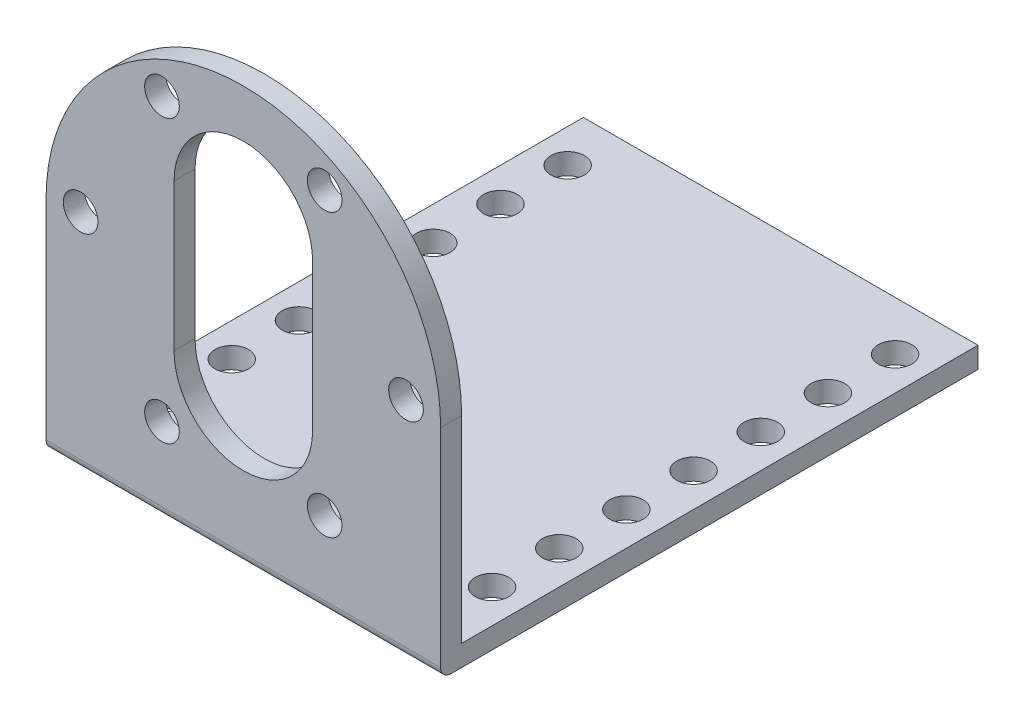
ISO-10303-21;
HEADER;
FILE_DESCRIPTION(('STEP AP214'),'2;1');
FILE_NAME('part.step','',(''),(''),'','','');
FILE_SCHEMA(('AUTOMOTIVE_DESIGN { 1 0 10303 214 1 1 1 1 }'));
ENDSEC;
DATA;
#1=APPLICATION_CONTEXT('core data for automotive mechanical design processes');
#2=APPLICATION_PROTOCOL_DEFINITION('international standard','automotive_design',2000,#1);
#3=PRODUCT_CONTEXT('',#1,'mechanical');
#4=PRODUCT('Part','Part','',(#3));
#5=PRODUCT_RELATED_PRODUCT_CATEGORY('part','',(#4));
#6=PRODUCT_DEFINITION_FORMATION('','',#4);
#7=PRODUCT_DEFINITION_CONTEXT('part definition',#1,'design');
#8=PRODUCT_DEFINITION('design','',#6,#7);
#9=PRODUCT_DEFINITION_SHAPE('','',#8);
#10=(LENGTH_UNIT() NAMED_UNIT(*) SI_UNIT(.MILLI.,.METRE.));
#11=(NAMED_UNIT(*) PLANE_ANGLE_UNIT() SI_UNIT($,.RADIAN.));
#12=(NAMED_UNIT(*) SI_UNIT($,.STERADIAN.) SOLID_ANGLE_UNIT());
#13=UNCERTAINTY_MEASURE_WITH_UNIT(LENGTH_MEASURE(1.E-05),#10,'distance_accuracy_value','');
#14=(GEOMETRIC_REPRESENTATION_CONTEXT(3) GLOBAL_UNCERTAINTY_ASSIGNED_CONTEXT((#13)) GLOBAL_UNIT_ASSIGNED_CONTEXT((#10,
#11,#12)) REPRESENTATION_CONTEXT('',''));
#15=CARTESIAN_POINT('',(0.,0.,0.));
#16=DIRECTION('',(0.,0.,1.));
#17=DIRECTION('',(1.,0.,0.));
#18=AXIS2_PLACEMENT_3D('',#15,#16,#17);
#19=CARTESIAN_POINT('',(37.6,-8.75642674796964,59.0660786090315));
#20=DIRECTION('',(0.,0.,1.));
#21=DIRECTION('',(1.,0.,0.));
#22=AXIS2_PLACEMENT_3D('',#19,#20,#21);
#23=PLANE('',#22);
#24=CARTESIAN_POINT('',(26.5499999999998,-2.73344871752294,59.0660786090315));
#25=DIRECTION('',(0.,0.,-1.));
#26=DIRECTION('',(-1.,0.,0.));
#27=AXIS2_PLACEMENT_3D('',#24,#25,#26);
#28=CIRCLE('',#27,1.65);
#29=CARTESIAN_POINT('',(24.8999999999998,-2.73344871752294,59.0660786090315));
#30=VERTEX_POINT('',#29);
#31=EDGE_CURVE('E358',#30,#30,#28,.T.);
#32=ORIENTED_EDGE('',*,*,#31,.F.);
#33=EDGE_LOOP('',(#32));
#34=FACE_BOUND('',#33,.T.);
#35=CARTESIAN_POINT('',(34.3,10.6899450411358,59.0660786090315));
#36=DIRECTION('',(0.,0.,-1.));
#37=DIRECTION('',(-1.,0.,0.));
#38=AXIS2_PLACEMENT_3D('',#35,#36,#37);
#39=CIRCLE('',#38,1.65);
#40=CARTESIAN_POINT('',(32.65,10.6899450411358,59.0660786090315));
#41=VERTEX_POINT('',#40);
#42=EDGE_CURVE('E352',#41,#41,#39,.T.);
#43=ORIENTED_EDGE('',*,*,#42,.F.);
#44=EDGE_LOOP('',(#43));
#45=FACE_BOUND('',#44,.T.);
#46=CARTESIAN_POINT('',(11.0499999999998,-2.73344871752267,59.0660786090315));
#47=DIRECTION('',(0.,0.,-1.));
#48=DIRECTION('',(-1.,0.,0.));
#49=AXIS2_PLACEMENT_3D('',#46,#47,#48);
#50=CIRCLE('',#49,1.65);
#51=CARTESIAN_POINT('',(9.39999999999975,-2.73344871752267,59.0660786090315));
#52=VERTEX_POINT('',#51);
#53=EDGE_CURVE('E346',#52,#52,#50,.T.);
#54=ORIENTED_EDGE('',*,*,#53,.F.);
#55=EDGE_LOOP('',(#54));
#56=FACE_BOUND('',#55,.T.);
#57=CARTESIAN_POINT('',(3.3,10.6899450411363,59.0660786090315));
#58=DIRECTION('',(0.,0.,-1.));
#59=DIRECTION('',(-1.,0.,0.));
#60=AXIS2_PLACEMENT_3D('',#57,#58,#59);
#61=CIRCLE('',#60,1.65);
#62=CARTESIAN_POINT('',(1.65,10.6899450411363,59.0660786090315));
#63=VERTEX_POINT('',#62);
#64=EDGE_CURVE('E340',#63,#63,#61,.T.);
#65=ORIENTED_EDGE('',*,*,#64,.F.);
#66=EDGE_LOOP('',(#65));
#67=FACE_BOUND('',#66,.T.);
#68=CARTESIAN_POINT('',(11.0500000000001,24.1133387997949,59.0660786090315));
#69=DIRECTION('',(0.,0.,-1.));
#70=DIRECTION('',(-1.,0.,0.));
#71=AXIS2_PLACEMENT_3D('',#68,#69,#70);
#72=CIRCLE('',#71,1.65);
#73=CARTESIAN_POINT('',(9.40000000000013,24.1133387997949,59.0660786090315));
#74=VERTEX_POINT('',#73);
#75=EDGE_CURVE('E334',#74,#74,#72,.T.);
#76=ORIENTED_EDGE('',*,*,#75,.F.);
#77=EDGE_LOOP('',(#76));
#78=FACE_BOUND('',#77,.T.);
#79=CARTESIAN_POINT('',(26.5500000000001,24.1133387997947,59.0660786090315));
#80=DIRECTION('',(0.,0.,-1.));
#81=DIRECTION('',(-1.,0.,0.));
#82=AXIS2_PLACEMENT_3D('',#79,#80,#81);
#83=CIRCLE('',#82,1.65);
#84=CARTESIAN_POINT('',(24.9000000000001,24.1133387997947,59.0660786090315));
#85=VERTEX_POINT('',#84);
#86=EDGE_CURVE('E331',#85,#85,#83,.T.);
#87=ORIENTED_EDGE('',*,*,#86,.F.);
#88=EDGE_LOOP('',(#87));
#89=FACE_BOUND('',#88,.T.);
#90=CARTESIAN_POINT('',(18.8,3.6899450411363,59.0660786090315));
#91=DIRECTION('',(0.,0.,-1.));
#92=DIRECTION('',(-1.,0.,0.));
#93=AXIS2_PLACEMENT_3D('',#90,#91,#92);
#94=CIRCLE('',#93,6.6);
#95=CARTESIAN_POINT('',(25.4,3.6899450411363,59.0660786090315));
#96=VERTEX_POINT('',#95);
#97=CARTESIAN_POINT('',(12.2,3.6899450411363,59.0660786090315));
#98=VERTEX_POINT('',#97);
#99=EDGE_CURVE('E236',#96,#98,#94,.T.);
#100=ORIENTED_EDGE('',*,*,#99,.F.);
#101=DIRECTION('',(0.,-1.,0.));
#102=VECTOR('',#101,1.);
#103=CARTESIAN_POINT('',(25.4,0.,59.0660786090315));
#104=LINE('',#103,#102);
#105=CARTESIAN_POINT('',(25.4,17.6899450411363,59.0660786090315));
#106=VERTEX_POINT('',#105);
#107=EDGE_CURVE('E74',#106,#96,#104,.T.);
#108=ORIENTED_EDGE('',*,*,#107,.F.);
#109=CARTESIAN_POINT('',(18.8,17.6899450411363,59.0660786090315));
#110=DIRECTION('',(0.,0.,-1.));
#111=DIRECTION('',(-1.,0.,0.));
#112=AXIS2_PLACEMENT_3D('',#109,#110,#111);
#113=CIRCLE('',#112,6.6);
#114=CARTESIAN_POINT('',(12.2,17.6899450411363,59.0660786090315));
#115=VERTEX_POINT('',#114);
#116=EDGE_CURVE('E214',#115,#106,#113,.T.);
#117=ORIENTED_EDGE('',*,*,#116,.F.);
#118=DIRECTION('',(0.,-1.,0.));
#119=VECTOR('',#118,1.);
#120=CARTESIAN_POINT('',(12.2,0.,59.0660786090315));
#121=LINE('',#120,#119);
#122=EDGE_CURVE('E238',#115,#98,#121,.T.);
#123=ORIENTED_EDGE('',*,*,#122,.T.);
#124=EDGE_LOOP('',(#100,#108,#117,#123));
#125=FACE_BOUND('',#124,.T.);
#126=DIRECTION('',(0.,1.,0.));
#127=VECTOR('',#126,1.);
#128=CARTESIAN_POINT('',(0.,-8.75642674796964,59.0660786090315));
#129=LINE('',#128,#127);
#130=CARTESIAN_POINT('',(0.,-8.75642674796964,59.0660786090315));
#131=VERTEX_POINT('',#130);
#132=CARTESIAN_POINT('',(0.,10.0435732520304,59.0660786090315));
#133=VERTEX_POINT('',#132);
#134=EDGE_CURVE('E146',#131,#133,#129,.T.);
#135=ORIENTED_EDGE('',*,*,#134,.T.);
#136=CARTESIAN_POINT('',(18.8,10.0435732520304,59.0660786090315));
#137=DIRECTION('',(0.,0.,-1.));
#138=DIRECTION('',(-1.,0.,0.));
#139=AXIS2_PLACEMENT_3D('',#136,#137,#138);
#140=CIRCLE('',#139,18.8);
#141=CARTESIAN_POINT('',(37.6,10.0435732520304,59.0660786090315));
#142=VERTEX_POINT('',#141);
#143=EDGE_CURVE('E132',#133,#142,#140,.T.);
#144=ORIENTED_EDGE('',*,*,#143,.T.);
#145=DIRECTION('',(0.,1.,0.));
#146=VECTOR('',#145,1.);
#147=CARTESIAN_POINT('',(37.6,-8.75642674796964,59.0660786090315));
#148=LINE('',#147,#146);
#149=CARTESIAN_POINT('',(37.6,-8.75642674796964,59.0660786090315));
#150=VERTEX_POINT('',#149);
#151=EDGE_CURVE('E196',#150,#142,#148,.T.);
#152=ORIENTED_EDGE('',*,*,#151,.F.);
#153=DIRECTION('',(-1.,0.,0.));
#154=VECTOR('',#153,1.);
#155=CARTESIAN_POINT('',(37.6,-8.75642674796964,59.0660786090315));
#156=LINE('',#155,#154);
#157=EDGE_CURVE('E59',#150,#131,#156,.T.);
#158=ORIENTED_EDGE('',*,*,#157,.T.);
#159=EDGE_LOOP('',(#135,#144,#152,#158));
#160=FACE_BOUND('',#159,.T.);
#161=ADVANCED_FACE('F51',(#34,#45,#56,#67,#78,#89,#125,#160),#23,.F.);
#162=CARTESIAN_POINT('',(37.6,28.8435732520304,61.0660786090315));
#163=DIRECTION('',(0.,0.,-1.));
#164=DIRECTION('',(-1.,0.,0.));
#165=AXIS2_PLACEMENT_3D('',#162,#163,#164);
#166=PLANE('',#165);
#167=CARTESIAN_POINT('',(26.5499999999998,-2.73344871752294,61.0660786090315));
#168=DIRECTION('',(0.,0.,-1.));
#169=DIRECTION('',(-1.,0.,0.));
#170=AXIS2_PLACEMENT_3D('',#167,#168,#169);
#171=CIRCLE('',#170,1.65);
#172=CARTESIAN_POINT('',(24.8999999999998,-2.73344871752294,61.0660786090315));
#173=VERTEX_POINT('',#172);
#174=EDGE_CURVE('E361',#173,#173,#171,.T.);
#175=ORIENTED_EDGE('',*,*,#174,.T.);
#176=EDGE_LOOP('',(#175));
#177=FACE_BOUND('',#176,.T.);
#178=CARTESIAN_POINT('',(34.3,10.6899450411358,61.0660786090315));
#179=DIRECTION('',(0.,0.,-1.));
#180=DIRECTION('',(-1.,0.,0.));
#181=AXIS2_PLACEMENT_3D('',#178,#179,#180);
#182=CIRCLE('',#181,1.65);
#183=CARTESIAN_POINT('',(32.65,10.6899450411358,61.0660786090315));
#184=VERTEX_POINT('',#183);
#185=EDGE_CURVE('E355',#184,#184,#182,.T.);
#186=ORIENTED_EDGE('',*,*,#185,.T.);
#187=EDGE_LOOP('',(#186));
#188=FACE_BOUND('',#187,.T.);
#189=CARTESIAN_POINT('',(11.0499999999998,-2.73344871752267,61.0660786090315));
#190=DIRECTION('',(0.,0.,-1.));
#191=DIRECTION('',(-1.,0.,0.));
#192=AXIS2_PLACEMENT_3D('',#189,#190,#191);
#193=CIRCLE('',#192,1.65);
#194=CARTESIAN_POINT('',(9.39999999999975,-2.73344871752267,61.0660786090315));
#195=VERTEX_POINT('',#194);
#196=EDGE_CURVE('E349',#195,#195,#193,.T.);
#197=ORIENTED_EDGE('',*,*,#196,.T.);
#198=EDGE_LOOP('',(#197));
#199=FACE_BOUND('',#198,.T.);
#200=CARTESIAN_POINT('',(3.3,10.6899450411363,61.0660786090315));
#201=DIRECTION('',(0.,0.,-1.));
#202=DIRECTION('',(-1.,0.,0.));
#203=AXIS2_PLACEMENT_3D('',#200,#201,#202);
#204=CIRCLE('',#203,1.65);
#205=CARTESIAN_POINT('',(1.65,10.6899450411363,61.0660786090315));
#206=VERTEX_POINT('',#205);
#207=EDGE_CURVE('E343',#206,#206,#204,.T.);
#208=ORIENTED_EDGE('',*,*,#207,.T.);
#209=EDGE_LOOP('',(#208));
#210=FACE_BOUND('',#209,.T.);
#211=CARTESIAN_POINT('',(11.0500000000001,24.1133387997949,61.0660786090315));
#212=DIRECTION('',(0.,0.,-1.));
#213=DIRECTION('',(-1.,0.,0.));
#214=AXIS2_PLACEMENT_3D('',#211,#212,#213);
#215=CIRCLE('',#214,1.65);
#216=CARTESIAN_POINT('',(9.40000000000013,24.1133387997949,61.0660786090315));
#217=VERTEX_POINT('',#216);
#218=EDGE_CURVE('E337',#217,#217,#215,.T.);
#219=ORIENTED_EDGE('',*,*,#218,.T.);
#220=EDGE_LOOP('',(#219));
#221=FACE_BOUND('',#220,.T.);
#222=CARTESIAN_POINT('',(26.5500000000001,24.1133387997947,61.0660786090315));
#223=DIRECTION('',(0.,0.,-1.));
#224=DIRECTION('',(-1.,0.,0.));
#225=AXIS2_PLACEMENT_3D('',#222,#223,#224);
#226=CIRCLE('',#225,1.65);
#227=CARTESIAN_POINT('',(24.9000000000001,24.1133387997947,61.0660786090315));
#228=VERTEX_POINT('',#227);
#229=EDGE_CURVE('E328',#228,#228,#226,.T.);
#230=ORIENTED_EDGE('',*,*,#229,.T.);
#231=EDGE_LOOP('',(#230));
#232=FACE_BOUND('',#231,.T.);
#233=CARTESIAN_POINT('',(18.8,17.6899450411363,61.0660786090315));
#234=DIRECTION('',(0.,0.,-1.));
#235=DIRECTION('',(-1.,0.,0.));
#236=AXIS2_PLACEMENT_3D('',#233,#234,#235);
#237=CIRCLE('',#236,6.6);
#238=CARTESIAN_POINT('',(12.2,17.6899450411363,61.0660786090315));
#239=VERTEX_POINT('',#238);
#240=CARTESIAN_POINT('',(25.4,17.6899450411363,61.0660786090315));
#241=VERTEX_POINT('',#240);
#242=EDGE_CURVE('E220',#239,#241,#237,.T.);
#243=ORIENTED_EDGE('',*,*,#242,.T.);
#244=DIRECTION('',(0.,-1.,0.));
#245=VECTOR('',#244,1.);
#246=CARTESIAN_POINT('',(25.4,0.,61.0660786090315));
#247=LINE('',#246,#245);
#248=CARTESIAN_POINT('',(25.4,3.6899450411363,61.0660786090315));
#249=VERTEX_POINT('',#248);
#250=EDGE_CURVE('E242',#241,#249,#247,.T.);
#251=ORIENTED_EDGE('',*,*,#250,.T.);
#252=CARTESIAN_POINT('',(18.8,3.6899450411363,61.0660786090315));
#253=DIRECTION('',(0.,0.,-1.));
#254=DIRECTION('',(-1.,0.,0.));
#255=AXIS2_PLACEMENT_3D('',#252,#253,#254);
#256=CIRCLE('',#255,6.6);
#257=CARTESIAN_POINT('',(12.2,3.6899450411363,61.0660786090315));
#258=VERTEX_POINT('',#257);
#259=EDGE_CURVE('E231',#249,#258,#256,.T.);
#260=ORIENTED_EDGE('',*,*,#259,.T.);
#261=DIRECTION('',(0.,-1.,0.));
#262=VECTOR('',#261,1.);
#263=CARTESIAN_POINT('',(12.2,0.,61.0660786090315));
#264=LINE('',#263,#262);
#265=EDGE_CURVE('E225',#239,#258,#264,.T.);
#266=ORIENTED_EDGE('',*,*,#265,.F.);
#267=EDGE_LOOP('',(#243,#251,#260,#266));
#268=FACE_BOUND('',#267,.T.);
#269=CARTESIAN_POINT('',(18.8,10.0435732520304,61.0660786090315));
#270=DIRECTION('',(0.,0.,-1.));
#271=DIRECTION('',(-1.,0.,0.));
#272=AXIS2_PLACEMENT_3D('',#269,#270,#271);
#273=CIRCLE('',#272,18.8);
#274=CARTESIAN_POINT('',(0.,10.0435732520304,61.0660786090315));
#275=VERTEX_POINT('',#274);
#276=CARTESIAN_POINT('',(37.6,10.0435732520304,61.0660786090315));
#277=VERTEX_POINT('',#276);
#278=EDGE_CURVE('E66',#275,#277,#273,.T.);
#279=ORIENTED_EDGE('',*,*,#278,.F.);
#280=DIRECTION('',(0.,-1.,0.));
#281=VECTOR('',#280,1.);
#282=CARTESIAN_POINT('',(0.,28.8435732520304,61.0660786090315));
#283=LINE('',#282,#281);
#284=CARTESIAN_POINT('',(0.,-9.75642674796964,61.0660786090315));
#285=VERTEX_POINT('',#284);
#286=EDGE_CURVE('E148',#275,#285,#283,.T.);
#287=ORIENTED_EDGE('',*,*,#286,.T.);
#288=DIRECTION('',(-1.,0.,0.));
#289=VECTOR('',#288,1.);
#290=CARTESIAN_POINT('',(37.6,-9.75642674796964,61.0660786090315));
#291=LINE('',#290,#289);
#292=CARTESIAN_POINT('',(37.6,-9.75642674796964,61.0660786090315));
#293=VERTEX_POINT('',#292);
#294=EDGE_CURVE('E171',#293,#285,#291,.T.);
#295=ORIENTED_EDGE('',*,*,#294,.F.);
#296=DIRECTION('',(0.,-1.,0.));
#297=VECTOR('',#296,1.);
#298=CARTESIAN_POINT('',(37.6,28.8435732520304,61.0660786090315));
#299=LINE('',#298,#297);
#300=EDGE_CURVE('E203',#277,#293,#299,.T.);
#301=ORIENTED_EDGE('',*,*,#300,.F.);
#302=EDGE_LOOP('',(#279,#287,#295,#301));
#303=FACE_BOUND('',#302,.T.);
#304=ADVANCED_FACE('F373',(#177,#188,#199,#210,#221,#232,#268,#303),#166,.F.);
#305=CARTESIAN_POINT('',(0.,-9.75642674796964,60.0660786090315));
#306=DIRECTION('',(-1.,0.,0.));
#307=DIRECTION('',(0.,0.,1.));
#308=AXIS2_PLACEMENT_3D('',#305,#306,#307);
#309=PLANE('',#308);
#310=ORIENTED_EDGE('',*,*,#286,.F.);
#311=DIRECTION('',(0.,0.,-1.));
#312=VECTOR('',#311,1.);
#313=CARTESIAN_POINT('',(0.,10.0435732520304,61.0660786090315));
#314=LINE('',#313,#312);
#315=EDGE_CURVE('E135',#275,#133,#314,.T.);
#316=ORIENTED_EDGE('',*,*,#315,.T.);
#317=ORIENTED_EDGE('',*,*,#134,.F.);
#318=DIRECTION('',(0.,0.,1.));
#319=VECTOR('',#318,1.);
#320=CARTESIAN_POINT('',(0.,-8.75642674796965,9.86607860903155));
#321=LINE('',#320,#319);
#322=CARTESIAN_POINT('',(0.,-8.75642674796965,9.86607860903155));
#323=VERTEX_POINT('',#322);
#324=EDGE_CURVE('E152',#323,#131,#321,.T.);
#325=ORIENTED_EDGE('',*,*,#324,.F.);
#326=DIRECTION('',(0.,1.,0.));
#327=VECTOR('',#326,1.);
#328=CARTESIAN_POINT('',(0.,-8.75642674796965,9.86607860903155));
#329=LINE('',#328,#327);
#330=CARTESIAN_POINT('',(0.,-10.7564267479696,9.86607860903155));
#331=VERTEX_POINT('',#330);
#332=EDGE_CURVE('E156',#331,#323,#329,.T.);
#333=ORIENTED_EDGE('',*,*,#332,.F.);
#334=DIRECTION('',(0.,0.,-1.));
#335=VECTOR('',#334,1.);
#336=CARTESIAN_POINT('',(0.,-10.7564267479696,9.86607860903155));
#337=LINE('',#336,#335);
#338=CARTESIAN_POINT('',(0.,-10.7564267479696,60.0660786090315));
#339=VERTEX_POINT('',#338);
#340=EDGE_CURVE('E161',#339,#331,#337,.T.);
#341=ORIENTED_EDGE('',*,*,#340,.F.);
#342=CARTESIAN_POINT('',(0.,-9.75642674796964,60.0660786090315));
#343=DIRECTION('',(1.,0.,0.));
#344=DIRECTION('',(0.,0.,1.));
#345=AXIS2_PLACEMENT_3D('',#342,#343,#344);
#346=CIRCLE('',#345,1.);
#347=EDGE_CURVE('E154',#285,#339,#346,.T.);
#348=ORIENTED_EDGE('',*,*,#347,.F.);
#349=EDGE_LOOP('',(#310,#316,#317,#325,#333,#341,#348));
#350=FACE_BOUND('',#349,.T.);
#351=ADVANCED_FACE('F145',(#350),#309,.T.);
#352=CARTESIAN_POINT('',(37.6,-9.75642674796964,60.0660786090315));
#353=DIRECTION('',(-1.,0.,0.));
#354=DIRECTION('',(0.,0.,1.));
#355=AXIS2_PLACEMENT_3D('',#352,#353,#354);
#356=PLANE('',#355);
#357=DIRECTION('',(0.,0.,-1.));
#358=VECTOR('',#357,1.);
#359=CARTESIAN_POINT('',(37.6,10.0435732520304,61.0660786090315));
#360=LINE('',#359,#358);
#361=EDGE_CURVE('E137',#277,#142,#360,.T.);
#362=ORIENTED_EDGE('',*,*,#361,.F.);
#363=ORIENTED_EDGE('',*,*,#300,.T.);
#364=CARTESIAN_POINT('',(37.6,-9.75642674796964,60.0660786090315));
#365=DIRECTION('',(1.,0.,0.));
#366=DIRECTION('',(0.,0.,1.));
#367=AXIS2_PLACEMENT_3D('',#364,#365,#366);
#368=CIRCLE('',#367,1.);
#369=CARTESIAN_POINT('',(37.6,-10.7564267479696,60.0660786090315));
#370=VERTEX_POINT('',#369);
#371=EDGE_CURVE('E178',#293,#370,#368,.T.);
#372=ORIENTED_EDGE('',*,*,#371,.T.);
#373=DIRECTION('',(0.,0.,-1.));
#374=VECTOR('',#373,1.);
#375=CARTESIAN_POINT('',(37.6,-10.7564267479696,9.86607860903155));
#376=LINE('',#375,#374);
#377=CARTESIAN_POINT('',(37.6,-10.7564267479696,9.86607860903155));
#378=VERTEX_POINT('',#377);
#379=EDGE_CURVE('E168',#370,#378,#376,.T.);
#380=ORIENTED_EDGE('',*,*,#379,.T.);
#381=DIRECTION('',(0.,1.,0.));
#382=VECTOR('',#381,1.);
#383=CARTESIAN_POINT('',(37.6,-8.75642674796965,9.86607860903155));
#384=LINE('',#383,#382);
#385=CARTESIAN_POINT('',(37.6,-8.75642674796965,9.86607860903155));
#386=VERTEX_POINT('',#385);
#387=EDGE_CURVE('E163',#378,#386,#384,.T.);
#388=ORIENTED_EDGE('',*,*,#387,.T.);
#389=DIRECTION('',(0.,0.,1.));
#390=VECTOR('',#389,1.);
#391=CARTESIAN_POINT('',(37.6,-8.75642674796965,9.86607860903155));
#392=LINE('',#391,#390);
#393=EDGE_CURVE('E194',#386,#150,#392,.T.);
#394=ORIENTED_EDGE('',*,*,#393,.T.);
#395=ORIENTED_EDGE('',*,*,#151,.T.);
#396=EDGE_LOOP('',(#362,#363,#372,#380,#388,#394,#395));
#397=FACE_BOUND('',#396,.T.);
#398=ADVANCED_FACE('F389',(#397),#356,.F.);
#399=CARTESIAN_POINT('',(37.6,-8.75642674796965,9.86607860903155));
#400=DIRECTION('',(0.,-1.,0.));
#401=DIRECTION('',(0.,0.,-1.));
#402=AXIS2_PLACEMENT_3D('',#399,#400,#401);
#403=PLANE('',#402);
#404=CARTESIAN_POINT('',(34.4,-8.75642674796965,14.5660786090315));
#405=DIRECTION('',(0.,1.,0.));
#406=DIRECTION('',(0.,0.,1.));
#407=AXIS2_PLACEMENT_3D('',#404,#405,#406);
#408=CIRCLE('',#407,1.6);
#409=CARTESIAN_POINT('',(34.4,-8.75642674796965,16.1660786090315));
#410=VERTEX_POINT('',#409);
#411=EDGE_CURVE('E322',#410,#410,#408,.T.);
#412=ORIENTED_EDGE('',*,*,#411,.F.);
#413=EDGE_LOOP('',(#412));
#414=FACE_BOUND('',#413,.T.);
#415=CARTESIAN_POINT('',(34.4000000000002,-8.75642674796965,33.7660786090316));
#416=DIRECTION('',(0.,1.,0.));
#417=DIRECTION('',(0.,0.,1.));
#418=AXIS2_PLACEMENT_3D('',#415,#416,#417);
#419=CIRCLE('',#418,1.6);
#420=CARTESIAN_POINT('',(34.4000000000002,-8.75642674796965,35.3660786090315));
#421=VERTEX_POINT('',#420);
#422=EDGE_CURVE('E316',#421,#421,#419,.T.);
#423=ORIENTED_EDGE('',*,*,#422,.F.);
#424=EDGE_LOOP('',(#423));
#425=FACE_BOUND('',#424,.T.);
#426=CARTESIAN_POINT('',(34.4000000000001,-8.75642674796965,20.9660786090315));
#427=DIRECTION('',(0.,1.,0.));
#428=DIRECTION('',(0.,0.,1.));
#429=AXIS2_PLACEMENT_3D('',#426,#427,#428);
#430=CIRCLE('',#429,1.6);
#431=CARTESIAN_POINT('',(34.4000000000001,-8.75642674796965,22.5660786090315));
#432=VERTEX_POINT('',#431);
#433=EDGE_CURVE('E310',#432,#432,#430,.T.);
#434=ORIENTED_EDGE('',*,*,#433,.F.);
#435=EDGE_LOOP('',(#434));
#436=FACE_BOUND('',#435,.T.);
#437=CARTESIAN_POINT('',(34.4000000000001,-8.75642674796965,27.3660786090316));
#438=DIRECTION('',(0.,1.,0.));
#439=DIRECTION('',(0.,0.,1.));
#440=AXIS2_PLACEMENT_3D('',#437,#438,#439);
#441=CIRCLE('',#440,1.6);
#442=CARTESIAN_POINT('',(34.4000000000001,-8.75642674796965,28.9660786090316));
#443=VERTEX_POINT('',#442);
#444=EDGE_CURVE('E304',#443,#443,#441,.T.);
#445=ORIENTED_EDGE('',*,*,#444,.F.);
#446=EDGE_LOOP('',(#445));
#447=FACE_BOUND('',#446,.T.);
#448=CARTESIAN_POINT('',(34.4000000000003,-8.75642674796965,40.1660786090316));
#449=DIRECTION('',(0.,1.,0.));
#450=DIRECTION('',(0.,0.,1.));
#451=AXIS2_PLACEMENT_3D('',#448,#449,#450);
#452=CIRCLE('',#451,1.6);
#453=CARTESIAN_POINT('',(34.4000000000003,-8.75642674796965,41.7660786090315));
#454=VERTEX_POINT('',#453);
#455=EDGE_CURVE('E298',#454,#454,#452,.T.);
#456=ORIENTED_EDGE('',*,*,#455,.F.);
#457=EDGE_LOOP('',(#456));
#458=FACE_BOUND('',#457,.T.);
#459=CARTESIAN_POINT('',(34.4000000000003,-8.75642674796964,46.5660786090315));
#460=DIRECTION('',(0.,1.,0.));
#461=DIRECTION('',(0.,0.,1.));
#462=AXIS2_PLACEMENT_3D('',#459,#460,#461);
#463=CIRCLE('',#462,1.6);
#464=CARTESIAN_POINT('',(34.4000000000003,-8.75642674796964,48.1660786090315));
#465=VERTEX_POINT('',#464);
#466=EDGE_CURVE('E292',#465,#465,#463,.T.);
#467=ORIENTED_EDGE('',*,*,#466,.F.);
#468=EDGE_LOOP('',(#467));
#469=FACE_BOUND('',#468,.T.);
#470=CARTESIAN_POINT('',(34.4000000000004,-8.75642674796964,52.9660786090315));
#471=DIRECTION('',(0.,1.,0.));
#472=DIRECTION('',(0.,0.,1.));
#473=AXIS2_PLACEMENT_3D('',#470,#471,#472);
#474=CIRCLE('',#473,1.6);
#475=CARTESIAN_POINT('',(34.4000000000004,-8.75642674796964,54.5660786090315));
#476=VERTEX_POINT('',#475);
#477=EDGE_CURVE('E286',#476,#476,#474,.T.);
#478=ORIENTED_EDGE('',*,*,#477,.F.);
#479=EDGE_LOOP('',(#478));
#480=FACE_BOUND('',#479,.T.);
#481=CARTESIAN_POINT('',(3.19999999999967,-8.75642674796964,46.5660786090315));
#482=DIRECTION('',(0.,1.,0.));
#483=DIRECTION('',(0.,0.,1.));
#484=AXIS2_PLACEMENT_3D('',#481,#482,#483);
#485=CIRCLE('',#484,1.6);
#486=CARTESIAN_POINT('',(3.19999999999967,-8.75642674796964,48.1660786090315));
#487=VERTEX_POINT('',#486);
#488=EDGE_CURVE('E274',#487,#487,#485,.F.);
#489=ORIENTED_EDGE('',*,*,#488,.T.);
#490=EDGE_LOOP('',(#489));
#491=FACE_BOUND('',#490,.T.);
#492=CARTESIAN_POINT('',(3.1999999999998,-8.75642674796965,33.7660786090316));
#493=DIRECTION('',(0.,1.,0.));
#494=DIRECTION('',(0.,0.,1.));
#495=AXIS2_PLACEMENT_3D('',#492,#493,#494);
#496=CIRCLE('',#495,1.6);
#497=CARTESIAN_POINT('',(3.1999999999998,-8.75642674796965,35.3660786090315));
#498=VERTEX_POINT('',#497);
#499=EDGE_CURVE('E262',#498,#498,#496,.F.);
#500=ORIENTED_EDGE('',*,*,#499,.T.);
#501=EDGE_LOOP('',(#500));
#502=FACE_BOUND('',#501,.T.);
#503=CARTESIAN_POINT('',(3.19999999999987,-8.75642674796965,27.3660786090316));
#504=DIRECTION('',(0.,1.,0.));
#505=DIRECTION('',(0.,0.,1.));
#506=AXIS2_PLACEMENT_3D('',#503,#504,#505);
#507=CIRCLE('',#506,1.6);
#508=CARTESIAN_POINT('',(3.19999999999987,-8.75642674796965,28.9660786090316));
#509=VERTEX_POINT('',#508);
#510=EDGE_CURVE('E250',#509,#509,#507,.F.);
#511=ORIENTED_EDGE('',*,*,#510,.T.);
#512=EDGE_LOOP('',(#511));
#513=FACE_BOUND('',#512,.T.);
#514=ORIENTED_EDGE('',*,*,#324,.T.);
#515=ORIENTED_EDGE('',*,*,#157,.F.);
#516=ORIENTED_EDGE('',*,*,#393,.F.);
#517=DIRECTION('',(-1.,0.,0.));
#518=VECTOR('',#517,1.);
#519=CARTESIAN_POINT('',(37.6,-8.75642674796965,9.86607860903155));
#520=LINE('',#519,#518);
#521=EDGE_CURVE('E12',#386,#323,#520,.T.);
#522=ORIENTED_EDGE('',*,*,#521,.T.);
#523=EDGE_LOOP('',(#514,#515,#516,#522));
#524=FACE_BOUND('',#523,.T.);
#525=CARTESIAN_POINT('',(3.2,-8.75642674796965,14.5660786090315));
#526=DIRECTION('',(0.,1.,0.));
#527=DIRECTION('',(0.,0.,1.));
#528=AXIS2_PLACEMENT_3D('',#525,#526,#527);
#529=CIRCLE('',#528,1.6);
#530=CARTESIAN_POINT('',(3.2,-8.75642674796965,16.1660786090315));
#531=VERTEX_POINT('',#530);
#532=EDGE_CURVE('E247',#531,#531,#529,.F.);
#533=ORIENTED_EDGE('',*,*,#532,.T.);
#534=EDGE_LOOP('',(#533));
#535=FACE_BOUND('',#534,.T.);
#536=CARTESIAN_POINT('',(3.19999999999993,-8.75642674796965,20.9660786090315));
#537=DIRECTION('',(0.,1.,0.));
#538=DIRECTION('',(0.,0.,1.));
#539=AXIS2_PLACEMENT_3D('',#536,#537,#538);
#540=CIRCLE('',#539,1.6);
#541=CARTESIAN_POINT('',(3.19999999999993,-8.75642674796965,22.5660786090315));
#542=VERTEX_POINT('',#541);
#543=EDGE_CURVE('E256',#542,#542,#540,.F.);
#544=ORIENTED_EDGE('',*,*,#543,.T.);
#545=EDGE_LOOP('',(#544));
#546=FACE_BOUND('',#545,.T.);
#547=CARTESIAN_POINT('',(3.19999999999973,-8.75642674796965,40.1660786090316));
#548=DIRECTION('',(0.,1.,0.));
#549=DIRECTION('',(0.,0.,1.));
#550=AXIS2_PLACEMENT_3D('',#547,#548,#549);
#551=CIRCLE('',#550,1.6);
#552=CARTESIAN_POINT('',(3.19999999999973,-8.75642674796965,41.7660786090315));
#553=VERTEX_POINT('',#552);
#554=EDGE_CURVE('E268',#553,#553,#551,.F.);
#555=ORIENTED_EDGE('',*,*,#554,.T.);
#556=EDGE_LOOP('',(#555));
#557=FACE_BOUND('',#556,.T.);
#558=CARTESIAN_POINT('',(3.1999999999996,-8.75642674796964,52.9660786090315));
#559=DIRECTION('',(0.,1.,0.));
#560=DIRECTION('',(0.,0.,1.));
#561=AXIS2_PLACEMENT_3D('',#558,#559,#560);
#562=CIRCLE('',#561,1.6);
#563=CARTESIAN_POINT('',(3.1999999999996,-8.75642674796964,54.5660786090315));
#564=VERTEX_POINT('',#563);
#565=EDGE_CURVE('E280',#564,#564,#562,.F.);
#566=ORIENTED_EDGE('',*,*,#565,.T.);
#567=EDGE_LOOP('',(#566));
#568=FACE_BOUND('',#567,.T.);
#569=ADVANCED_FACE('F391',(#414,#425,#436,#447,#458,#469,#480,#491,#502,#513,#524,#535,#546,
#557,#568),#403,.F.);
#570=CARTESIAN_POINT('',(37.6,-10.7564267479696,9.86607860903155));
#571=DIRECTION('',(0.,1.,0.));
#572=DIRECTION('',(0.,0.,1.));
#573=AXIS2_PLACEMENT_3D('',#570,#571,#572);
#574=PLANE('',#573);
#575=CARTESIAN_POINT('',(34.4,-10.7564267479697,14.5660786090315));
#576=DIRECTION('',(0.,1.,0.));
#577=DIRECTION('',(0.,0.,1.));
#578=AXIS2_PLACEMENT_3D('',#575,#576,#577);
#579=CIRCLE('',#578,1.6);
#580=CARTESIAN_POINT('',(34.4,-10.7564267479697,16.1660786090315));
#581=VERTEX_POINT('',#580);
#582=EDGE_CURVE('E325',#581,#581,#579,.T.);
#583=ORIENTED_EDGE('',*,*,#582,.T.);
#584=EDGE_LOOP('',(#583));
#585=FACE_BOUND('',#584,.T.);
#586=CARTESIAN_POINT('',(34.4000000000002,-10.7564267479697,33.7660786090316));
#587=DIRECTION('',(0.,1.,0.));
#588=DIRECTION('',(0.,0.,1.));
#589=AXIS2_PLACEMENT_3D('',#586,#587,#588);
#590=CIRCLE('',#589,1.6);
#591=CARTESIAN_POINT('',(34.4000000000002,-10.7564267479697,35.3660786090315));
#592=VERTEX_POINT('',#591);
#593=EDGE_CURVE('E319',#592,#592,#590,.T.);
#594=ORIENTED_EDGE('',*,*,#593,.T.);
#595=EDGE_LOOP('',(#594));
#596=FACE_BOUND('',#595,.T.);
#597=CARTESIAN_POINT('',(34.4000000000001,-10.7564267479697,20.9660786090315));
#598=DIRECTION('',(0.,1.,0.));
#599=DIRECTION('',(0.,0.,1.));
#600=AXIS2_PLACEMENT_3D('',#597,#598,#599);
#601=CIRCLE('',#600,1.6);
#602=CARTESIAN_POINT('',(34.4000000000001,-10.7564267479697,22.5660786090315));
#603=VERTEX_POINT('',#602);
#604=EDGE_CURVE('E313',#603,#603,#601,.T.);
#605=ORIENTED_EDGE('',*,*,#604,.T.);
#606=EDGE_LOOP('',(#605));
#607=FACE_BOUND('',#606,.T.);
#608=CARTESIAN_POINT('',(34.4000000000001,-10.7564267479697,27.3660786090316));
#609=DIRECTION('',(0.,1.,0.));
#610=DIRECTION('',(0.,0.,1.));
#611=AXIS2_PLACEMENT_3D('',#608,#609,#610);
#612=CIRCLE('',#611,1.6);
#613=CARTESIAN_POINT('',(34.4000000000001,-10.7564267479697,28.9660786090316));
#614=VERTEX_POINT('',#613);
#615=EDGE_CURVE('E307',#614,#614,#612,.T.);
#616=ORIENTED_EDGE('',*,*,#615,.T.);
#617=EDGE_LOOP('',(#616));
#618=FACE_BOUND('',#617,.T.);
#619=CARTESIAN_POINT('',(34.4000000000003,-10.7564267479696,40.1660786090316));
#620=DIRECTION('',(0.,1.,0.));
#621=DIRECTION('',(0.,0.,1.));
#622=AXIS2_PLACEMENT_3D('',#619,#620,#621);
#623=CIRCLE('',#622,1.6);
#624=CARTESIAN_POINT('',(34.4000000000003,-10.7564267479696,41.7660786090315));
#625=VERTEX_POINT('',#624);
#626=EDGE_CURVE('E301',#625,#625,#623,.T.);
#627=ORIENTED_EDGE('',*,*,#626,.T.);
#628=EDGE_LOOP('',(#627));
#629=FACE_BOUND('',#628,.T.);
#630=CARTESIAN_POINT('',(34.4000000000003,-10.7564267479696,46.5660786090315));
#631=DIRECTION('',(0.,1.,0.));
#632=DIRECTION('',(0.,0.,1.));
#633=AXIS2_PLACEMENT_3D('',#630,#631,#632);
#634=CIRCLE('',#633,1.6);
#635=CARTESIAN_POINT('',(34.4000000000003,-10.7564267479696,48.1660786090315));
#636=VERTEX_POINT('',#635);
#637=EDGE_CURVE('E295',#636,#636,#634,.T.);
#638=ORIENTED_EDGE('',*,*,#637,.T.);
#639=EDGE_LOOP('',(#638));
#640=FACE_BOUND('',#639,.T.);
#641=CARTESIAN_POINT('',(34.4000000000004,-10.7564267479696,52.9660786090315));
#642=DIRECTION('',(0.,1.,0.));
#643=DIRECTION('',(0.,0.,1.));
#644=AXIS2_PLACEMENT_3D('',#641,#642,#643);
#645=CIRCLE('',#644,1.6);
#646=CARTESIAN_POINT('',(34.4000000000004,-10.7564267479696,54.5660786090315));
#647=VERTEX_POINT('',#646);
#648=EDGE_CURVE('E289',#647,#647,#645,.T.);
#649=ORIENTED_EDGE('',*,*,#648,.T.);
#650=EDGE_LOOP('',(#649));
#651=FACE_BOUND('',#650,.T.);
#652=CARTESIAN_POINT('',(3.19999999999967,-10.7564267479696,46.5660786090315));
#653=DIRECTION('',(0.,1.,0.));
#654=DIRECTION('',(0.,0.,1.));
#655=AXIS2_PLACEMENT_3D('',#652,#653,#654);
#656=CIRCLE('',#655,1.6);
#657=CARTESIAN_POINT('',(3.19999999999967,-10.7564267479696,48.1660786090315));
#658=VERTEX_POINT('',#657);
#659=EDGE_CURVE('E277',#658,#658,#656,.F.);
#660=ORIENTED_EDGE('',*,*,#659,.F.);
#661=EDGE_LOOP('',(#660));
#662=FACE_BOUND('',#661,.T.);
#663=CARTESIAN_POINT('',(3.1999999999998,-10.7564267479697,33.7660786090316));
#664=DIRECTION('',(0.,1.,0.));
#665=DIRECTION('',(0.,0.,1.));
#666=AXIS2_PLACEMENT_3D('',#663,#664,#665);
#667=CIRCLE('',#666,1.6);
#668=CARTESIAN_POINT('',(3.1999999999998,-10.7564267479697,35.3660786090315));
#669=VERTEX_POINT('',#668);
#670=EDGE_CURVE('E265',#669,#669,#667,.F.);
#671=ORIENTED_EDGE('',*,*,#670,.F.);
#672=EDGE_LOOP('',(#671));
#673=FACE_BOUND('',#672,.T.);
#674=CARTESIAN_POINT('',(3.19999999999987,-10.7564267479697,27.3660786090316));
#675=DIRECTION('',(0.,1.,0.));
#676=DIRECTION('',(0.,0.,1.));
#677=AXIS2_PLACEMENT_3D('',#674,#675,#676);
#678=CIRCLE('',#677,1.6);
#679=CARTESIAN_POINT('',(3.19999999999987,-10.7564267479697,28.9660786090316));
#680=VERTEX_POINT('',#679);
#681=EDGE_CURVE('E253',#680,#680,#678,.F.);
#682=ORIENTED_EDGE('',*,*,#681,.F.);
#683=EDGE_LOOP('',(#682));
#684=FACE_BOUND('',#683,.T.);
#685=ORIENTED_EDGE('',*,*,#340,.T.);
#686=DIRECTION('',(-1.,0.,0.));
#687=VECTOR('',#686,1.);
#688=CARTESIAN_POINT('',(37.6,-10.7564267479696,9.86607860903155));
#689=LINE('',#688,#687);
#690=EDGE_CURVE('E164',#378,#331,#689,.T.);
#691=ORIENTED_EDGE('',*,*,#690,.F.);
#692=ORIENTED_EDGE('',*,*,#379,.F.);
#693=DIRECTION('',(-1.,0.,0.));
#694=VECTOR('',#693,1.);
#695=CARTESIAN_POINT('',(37.6,-10.7564267479696,60.0660786090315));
#696=LINE('',#695,#694);
#697=EDGE_CURVE('E167',#370,#339,#696,.T.);
#698=ORIENTED_EDGE('',*,*,#697,.T.);
#699=EDGE_LOOP('',(#685,#691,#692,#698));
#700=FACE_BOUND('',#699,.T.);
#701=CARTESIAN_POINT('',(3.2,-10.7564267479697,14.5660786090315));
#702=DIRECTION('',(0.,1.,0.));
#703=DIRECTION('',(0.,0.,1.));
#704=AXIS2_PLACEMENT_3D('',#701,#702,#703);
#705=CIRCLE('',#704,1.6);
#706=CARTESIAN_POINT('',(3.2,-10.7564267479697,16.1660786090315));
#707=VERTEX_POINT('',#706);
#708=EDGE_CURVE('E237',#707,#707,#705,.F.);
#709=ORIENTED_EDGE('',*,*,#708,.F.);
#710=EDGE_LOOP('',(#709));
#711=FACE_BOUND('',#710,.T.);
#712=CARTESIAN_POINT('',(3.19999999999993,-10.7564267479697,20.9660786090315));
#713=DIRECTION('',(0.,1.,0.));
#714=DIRECTION('',(0.,0.,1.));
#715=AXIS2_PLACEMENT_3D('',#712,#713,#714);
#716=CIRCLE('',#715,1.6);
#717=CARTESIAN_POINT('',(3.19999999999993,-10.7564267479697,22.5660786090315));
#718=VERTEX_POINT('',#717);
#719=EDGE_CURVE('E259',#718,#718,#716,.F.);
#720=ORIENTED_EDGE('',*,*,#719,.F.);
#721=EDGE_LOOP('',(#720));
#722=FACE_BOUND('',#721,.T.);
#723=CARTESIAN_POINT('',(3.19999999999973,-10.7564267479696,40.1660786090316));
#724=DIRECTION('',(0.,1.,0.));
#725=DIRECTION('',(0.,0.,1.));
#726=AXIS2_PLACEMENT_3D('',#723,#724,#725);
#727=CIRCLE('',#726,1.6);
#728=CARTESIAN_POINT('',(3.19999999999973,-10.7564267479696,41.7660786090315));
#729=VERTEX_POINT('',#728);
#730=EDGE_CURVE('E271',#729,#729,#727,.F.);
#731=ORIENTED_EDGE('',*,*,#730,.F.);
#732=EDGE_LOOP('',(#731));
#733=FACE_BOUND('',#732,.T.);
#734=CARTESIAN_POINT('',(3.1999999999996,-10.7564267479696,52.9660786090315));
#735=DIRECTION('',(0.,1.,0.));
#736=DIRECTION('',(0.,0.,1.));
#737=AXIS2_PLACEMENT_3D('',#734,#735,#736);
#738=CIRCLE('',#737,1.6);
#739=CARTESIAN_POINT('',(3.1999999999996,-10.7564267479696,54.5660786090315));
#740=VERTEX_POINT('',#739);
#741=EDGE_CURVE('E283',#740,#740,#738,.F.);
#742=ORIENTED_EDGE('',*,*,#741,.F.);
#743=EDGE_LOOP('',(#742));
#744=FACE_BOUND('',#743,.T.);
#745=ADVANCED_FACE('F186',(#585,#596,#607,#618,#629,#640,#651,#662,#673,#684,#700,#711,#722,
#733,#744),#574,.F.);
#746=CARTESIAN_POINT('',(37.6,-8.75642674796965,9.86607860903155));
#747=DIRECTION('',(0.,0.,1.));
#748=DIRECTION('',(1.,0.,0.));
#749=AXIS2_PLACEMENT_3D('',#746,#747,#748);
#750=PLANE('',#749);
#751=ORIENTED_EDGE('',*,*,#332,.T.);
#752=ORIENTED_EDGE('',*,*,#521,.F.);
#753=ORIENTED_EDGE('',*,*,#387,.F.);
#754=ORIENTED_EDGE('',*,*,#690,.T.);
#755=EDGE_LOOP('',(#751,#752,#753,#754));
#756=FACE_BOUND('',#755,.T.);
#757=ADVANCED_FACE('F53',(#756),#750,.F.);
#758=CARTESIAN_POINT('',(37.6,-9.75642674796964,60.0660786090315));
#759=DIRECTION('',(-1.,0.,0.));
#760=DIRECTION('',(0.,0.,1.));
#761=AXIS2_PLACEMENT_3D('',#758,#759,#760);
#762=CYLINDRICAL_SURFACE('',#761,1.);
#763=ORIENTED_EDGE('',*,*,#347,.T.);
#764=ORIENTED_EDGE('',*,*,#697,.F.);
#765=ORIENTED_EDGE('',*,*,#371,.F.);
#766=ORIENTED_EDGE('',*,*,#294,.T.);
#767=EDGE_LOOP('',(#763,#764,#765,#766));
#768=FACE_BOUND('',#767,.T.);
#769=ADVANCED_FACE('F176',(#768),#762,.T.);
#770=CARTESIAN_POINT('',(25.4,0.,61.0660786090315));
#771=DIRECTION('',(1.,0.,0.));
#772=DIRECTION('',(0.,0.,-1.));
#773=AXIS2_PLACEMENT_3D('',#770,#771,#772);
#774=PLANE('',#773);
#775=ORIENTED_EDGE('',*,*,#107,.T.);
#776=DIRECTION('',(0.,0.,-1.));
#777=VECTOR('',#776,1.);
#778=CARTESIAN_POINT('',(25.4,3.6899450411363,61.0660786090315));
#779=LINE('',#778,#777);
#780=EDGE_CURVE('E199',#249,#96,#779,.T.);
#781=ORIENTED_EDGE('',*,*,#780,.F.);
#782=ORIENTED_EDGE('',*,*,#250,.F.);
#783=DIRECTION('',(0.,0.,-1.));
#784=VECTOR('',#783,1.);
#785=CARTESIAN_POINT('',(25.4,17.6899450411363,61.0660786090315));
#786=LINE('',#785,#784);
#787=EDGE_CURVE('E206',#241,#106,#786,.T.);
#788=ORIENTED_EDGE('',*,*,#787,.T.);
#789=EDGE_LOOP('',(#775,#781,#782,#788));
#790=FACE_BOUND('',#789,.T.);
#791=ADVANCED_FACE('F443',(#790),#774,.F.);
#792=CARTESIAN_POINT('',(18.8,17.6899450411363,61.0660786090315));
#793=DIRECTION('',(0.,0.,-1.));
#794=DIRECTION('',(-1.,0.,0.));
#795=AXIS2_PLACEMENT_3D('',#792,#793,#794);
#796=CYLINDRICAL_SURFACE('',#795,6.6);
#797=ORIENTED_EDGE('',*,*,#116,.T.);
#798=ORIENTED_EDGE('',*,*,#787,.F.);
#799=ORIENTED_EDGE('',*,*,#242,.F.);
#800=DIRECTION('',(0.,0.,-1.));
#801=VECTOR('',#800,1.);
#802=CARTESIAN_POINT('',(12.2,17.6899450411363,61.0660786090315));
#803=LINE('',#802,#801);
#804=EDGE_CURVE('E207',#239,#115,#803,.T.);
#805=ORIENTED_EDGE('',*,*,#804,.T.);
#806=EDGE_LOOP('',(#797,#798,#799,#805));
#807=FACE_BOUND('',#806,.T.);
#808=ADVANCED_FACE('F440',(#807),#796,.F.);
#809=CARTESIAN_POINT('',(12.2,0.,61.0660786090315));
#810=DIRECTION('',(1.,0.,0.));
#811=DIRECTION('',(0.,0.,-1.));
#812=AXIS2_PLACEMENT_3D('',#809,#810,#811);
#813=PLANE('',#812);
#814=ORIENTED_EDGE('',*,*,#122,.F.);
#815=ORIENTED_EDGE('',*,*,#804,.F.);
#816=ORIENTED_EDGE('',*,*,#265,.T.);
#817=DIRECTION('',(0.,0.,-1.));
#818=VECTOR('',#817,1.);
#819=CARTESIAN_POINT('',(12.2,3.6899450411363,61.0660786090315));
#820=LINE('',#819,#818);
#821=EDGE_CURVE('E211',#258,#98,#820,.T.);
#822=ORIENTED_EDGE('',*,*,#821,.T.);
#823=EDGE_LOOP('',(#814,#815,#816,#822));
#824=FACE_BOUND('',#823,.T.);
#825=ADVANCED_FACE('F385',(#824),#813,.T.);
#826=CARTESIAN_POINT('',(18.8,3.6899450411363,61.0660786090315));
#827=DIRECTION('',(0.,0.,-1.));
#828=DIRECTION('',(-1.,0.,0.));
#829=AXIS2_PLACEMENT_3D('',#826,#827,#828);
#830=CYLINDRICAL_SURFACE('',#829,6.6);
#831=ORIENTED_EDGE('',*,*,#99,.T.);
#832=ORIENTED_EDGE('',*,*,#821,.F.);
#833=ORIENTED_EDGE('',*,*,#259,.F.);
#834=ORIENTED_EDGE('',*,*,#780,.T.);
#835=EDGE_LOOP('',(#831,#832,#833,#834));
#836=FACE_BOUND('',#835,.T.);
#837=ADVANCED_FACE('F384',(#836),#830,.F.);
#838=CARTESIAN_POINT('',(3.2,-10.7564267479697,14.5660786090315));
#839=DIRECTION('',(0.,1.,0.));
#840=DIRECTION('',(0.,0.,1.));
#841=AXIS2_PLACEMENT_3D('',#838,#839,#840);
#842=CYLINDRICAL_SURFACE('',#841,1.6);
#843=ORIENTED_EDGE('',*,*,#708,.T.);
#844=EDGE_LOOP('',(#843));
#845=FACE_BOUND('',#844,.T.);
#846=ORIENTED_EDGE('',*,*,#532,.F.);
#847=EDGE_LOOP('',(#846));
#848=FACE_BOUND('',#847,.T.);
#849=ADVANCED_FACE('F435',(#845,#848),#842,.F.);
#850=CARTESIAN_POINT('',(3.19999999999987,-10.7564267479697,27.3660786090316));
#851=DIRECTION('',(0.,1.,0.));
#852=DIRECTION('',(0.,0.,1.));
#853=AXIS2_PLACEMENT_3D('',#850,#851,#852);
#854=CYLINDRICAL_SURFACE('',#853,1.6);
#855=ORIENTED_EDGE('',*,*,#681,.T.);
#856=EDGE_LOOP('',(#855));
#857=FACE_BOUND('',#856,.T.);
#858=ORIENTED_EDGE('',*,*,#510,.F.);
#859=EDGE_LOOP('',(#858));
#860=FACE_BOUND('',#859,.T.);
#861=ADVANCED_FACE('F431',(#857,#860),#854,.F.);
#862=CARTESIAN_POINT('',(3.19999999999993,-10.7564267479697,20.9660786090315));
#863=DIRECTION('',(0.,1.,0.));
#864=DIRECTION('',(0.,0.,1.));
#865=AXIS2_PLACEMENT_3D('',#862,#863,#864);
#866=CYLINDRICAL_SURFACE('',#865,1.6);
#867=ORIENTED_EDGE('',*,*,#719,.T.);
#868=EDGE_LOOP('',(#867));
#869=FACE_BOUND('',#868,.T.);
#870=ORIENTED_EDGE('',*,*,#543,.F.);
#871=EDGE_LOOP('',(#870));
#872=FACE_BOUND('',#871,.T.);
#873=ADVANCED_FACE('F427',(#869,#872),#866,.F.);
#874=CARTESIAN_POINT('',(3.1999999999998,-10.7564267479697,33.7660786090316));
#875=DIRECTION('',(0.,1.,0.));
#876=DIRECTION('',(0.,0.,1.));
#877=AXIS2_PLACEMENT_3D('',#874,#875,#876);
#878=CYLINDRICAL_SURFACE('',#877,1.6);
#879=ORIENTED_EDGE('',*,*,#670,.T.);
#880=EDGE_LOOP('',(#879));
#881=FACE_BOUND('',#880,.T.);
#882=ORIENTED_EDGE('',*,*,#499,.F.);
#883=EDGE_LOOP('',(#882));
#884=FACE_BOUND('',#883,.T.);
#885=ADVANCED_FACE('F423',(#881,#884),#878,.F.);
#886=CARTESIAN_POINT('',(3.19999999999973,-10.7564267479696,40.1660786090316));
#887=DIRECTION('',(0.,1.,0.));
#888=DIRECTION('',(0.,0.,1.));
#889=AXIS2_PLACEMENT_3D('',#886,#887,#888);
#890=CYLINDRICAL_SURFACE('',#889,1.6);
#891=ORIENTED_EDGE('',*,*,#730,.T.);
#892=EDGE_LOOP('',(#891));
#893=FACE_BOUND('',#892,.T.);
#894=ORIENTED_EDGE('',*,*,#554,.F.);
#895=EDGE_LOOP('',(#894));
#896=FACE_BOUND('',#895,.T.);
#897=ADVANCED_FACE('F416',(#893,#896),#890,.F.);
#898=CARTESIAN_POINT('',(3.19999999999967,-10.7564267479696,46.5660786090315));
#899=DIRECTION('',(0.,1.,0.));
#900=DIRECTION('',(0.,0.,1.));
#901=AXIS2_PLACEMENT_3D('',#898,#899,#900);
#902=CYLINDRICAL_SURFACE('',#901,1.6);
#903=ORIENTED_EDGE('',*,*,#659,.T.);
#904=EDGE_LOOP('',(#903));
#905=FACE_BOUND('',#904,.T.);
#906=ORIENTED_EDGE('',*,*,#488,.F.);
#907=EDGE_LOOP('',(#906));
#908=FACE_BOUND('',#907,.T.);
#909=ADVANCED_FACE('F406',(#905,#908),#902,.F.);
#910=CARTESIAN_POINT('',(3.1999999999996,-10.7564267479696,52.9660786090315));
#911=DIRECTION('',(0.,1.,0.));
#912=DIRECTION('',(0.,0.,1.));
#913=AXIS2_PLACEMENT_3D('',#910,#911,#912);
#914=CYLINDRICAL_SURFACE('',#913,1.6);
#915=ORIENTED_EDGE('',*,*,#741,.T.);
#916=EDGE_LOOP('',(#915));
#917=FACE_BOUND('',#916,.T.);
#918=ORIENTED_EDGE('',*,*,#565,.F.);
#919=EDGE_LOOP('',(#918));
#920=FACE_BOUND('',#919,.T.);
#921=ADVANCED_FACE('F403',(#917,#920),#914,.F.);
#922=CARTESIAN_POINT('',(34.4000000000004,-10.7564267479696,52.9660786090315));
#923=DIRECTION('',(0.,1.,0.));
#924=DIRECTION('',(0.,0.,1.));
#925=AXIS2_PLACEMENT_3D('',#922,#923,#924);
#926=CYLINDRICAL_SURFACE('',#925,1.6);
#927=ORIENTED_EDGE('',*,*,#648,.F.);
#928=EDGE_LOOP('',(#927));
#929=FACE_BOUND('',#928,.T.);
#930=ORIENTED_EDGE('',*,*,#477,.T.);
#931=EDGE_LOOP('',(#930));
#932=FACE_BOUND('',#931,.T.);
#933=ADVANCED_FACE('F405',(#929,#932),#926,.F.);
#934=CARTESIAN_POINT('',(34.4000000000003,-10.7564267479696,46.5660786090315));
#935=DIRECTION('',(0.,1.,0.));
#936=DIRECTION('',(0.,0.,1.));
#937=AXIS2_PLACEMENT_3D('',#934,#935,#936);
#938=CYLINDRICAL_SURFACE('',#937,1.6);
#939=ORIENTED_EDGE('',*,*,#637,.F.);
#940=EDGE_LOOP('',(#939));
#941=FACE_BOUND('',#940,.T.);
#942=ORIENTED_EDGE('',*,*,#466,.T.);
#943=EDGE_LOOP('',(#942));
#944=FACE_BOUND('',#943,.T.);
#945=ADVANCED_FACE('F413',(#941,#944),#938,.F.);
#946=CARTESIAN_POINT('',(34.4000000000003,-10.7564267479696,40.1660786090316));
#947=DIRECTION('',(0.,1.,0.));
#948=DIRECTION('',(0.,0.,1.));
#949=AXIS2_PLACEMENT_3D('',#946,#947,#948);
#950=CYLINDRICAL_SURFACE('',#949,1.6);
#951=ORIENTED_EDGE('',*,*,#626,.F.);
#952=EDGE_LOOP('',(#951));
#953=FACE_BOUND('',#952,.T.);
#954=ORIENTED_EDGE('',*,*,#455,.T.);
#955=EDGE_LOOP('',(#954));
#956=FACE_BOUND('',#955,.T.);
#957=ADVANCED_FACE('F591',(#953,#956),#950,.F.);
#958=CARTESIAN_POINT('',(34.4000000000001,-10.7564267479697,27.3660786090316));
#959=DIRECTION('',(0.,1.,0.));
#960=DIRECTION('',(0.,0.,1.));
#961=AXIS2_PLACEMENT_3D('',#958,#959,#960);
#962=CYLINDRICAL_SURFACE('',#961,1.6);
#963=ORIENTED_EDGE('',*,*,#615,.F.);
#964=EDGE_LOOP('',(#963));
#965=FACE_BOUND('',#964,.T.);
#966=ORIENTED_EDGE('',*,*,#444,.T.);
#967=EDGE_LOOP('',(#966));
#968=FACE_BOUND('',#967,.T.);
#969=ADVANCED_FACE('F581',(#965,#968),#962,.F.);
#970=CARTESIAN_POINT('',(34.4000000000001,-10.7564267479697,20.9660786090315));
#971=DIRECTION('',(0.,1.,0.));
#972=DIRECTION('',(0.,0.,1.));
#973=AXIS2_PLACEMENT_3D('',#970,#971,#972);
#974=CYLINDRICAL_SURFACE('',#973,1.6);
#975=ORIENTED_EDGE('',*,*,#604,.F.);
#976=EDGE_LOOP('',(#975));
#977=FACE_BOUND('',#976,.T.);
#978=ORIENTED_EDGE('',*,*,#433,.T.);
#979=EDGE_LOOP('',(#978));
#980=FACE_BOUND('',#979,.T.);
#981=ADVANCED_FACE('F571',(#977,#980),#974,.F.);
#982=CARTESIAN_POINT('',(34.4000000000002,-10.7564267479697,33.7660786090316));
#983=DIRECTION('',(0.,1.,0.));
#984=DIRECTION('',(0.,0.,1.));
#985=AXIS2_PLACEMENT_3D('',#982,#983,#984);
#986=CYLINDRICAL_SURFACE('',#985,1.6);
#987=ORIENTED_EDGE('',*,*,#593,.F.);
#988=EDGE_LOOP('',(#987));
#989=FACE_BOUND('',#988,.T.);
#990=ORIENTED_EDGE('',*,*,#422,.T.);
#991=EDGE_LOOP('',(#990));
#992=FACE_BOUND('',#991,.T.);
#993=ADVANCED_FACE('F561',(#989,#992),#986,.F.);
#994=CARTESIAN_POINT('',(34.4,-10.7564267479697,14.5660786090315));
#995=DIRECTION('',(0.,1.,0.));
#996=DIRECTION('',(0.,0.,1.));
#997=AXIS2_PLACEMENT_3D('',#994,#995,#996);
#998=CYLINDRICAL_SURFACE('',#997,1.6);
#999=ORIENTED_EDGE('',*,*,#582,.F.);
#1000=EDGE_LOOP('',(#999));
#1001=FACE_BOUND('',#1000,.T.);
#1002=ORIENTED_EDGE('',*,*,#411,.T.);
#1003=EDGE_LOOP('',(#1002));
#1004=FACE_BOUND('',#1003,.T.);
#1005=ADVANCED_FACE('F551',(#1001,#1004),#998,.F.);
#1006=CARTESIAN_POINT('',(26.5500000000001,24.1133387997947,61.0660786090315));
#1007=DIRECTION('',(0.,0.,-1.));
#1008=DIRECTION('',(-1.,0.,0.));
#1009=AXIS2_PLACEMENT_3D('',#1006,#1007,#1008);
#1010=CYLINDRICAL_SURFACE('',#1009,1.65);
#1011=ORIENTED_EDGE('',*,*,#229,.F.);
#1012=EDGE_LOOP('',(#1011));
#1013=FACE_BOUND('',#1012,.T.);
#1014=ORIENTED_EDGE('',*,*,#86,.T.);
#1015=EDGE_LOOP('',(#1014));
#1016=FACE_BOUND('',#1015,.T.);
#1017=ADVANCED_FACE('F541',(#1013,#1016),#1010,.F.);
#1018=CARTESIAN_POINT('',(11.0500000000001,24.1133387997949,61.0660786090315));
#1019=DIRECTION('',(0.,0.,-1.));
#1020=DIRECTION('',(-1.,0.,0.));
#1021=AXIS2_PLACEMENT_3D('',#1018,#1019,#1020);
#1022=CYLINDRICAL_SURFACE('',#1021,1.65);
#1023=ORIENTED_EDGE('',*,*,#218,.F.);
#1024=EDGE_LOOP('',(#1023));
#1025=FACE_BOUND('',#1024,.T.);
#1026=ORIENTED_EDGE('',*,*,#75,.T.);
#1027=EDGE_LOOP('',(#1026));
#1028=FACE_BOUND('',#1027,.T.);
#1029=ADVANCED_FACE('F531',(#1025,#1028),#1022,.F.);
#1030=CARTESIAN_POINT('',(3.3,10.6899450411363,61.0660786090315));
#1031=DIRECTION('',(0.,0.,-1.));
#1032=DIRECTION('',(-1.,0.,0.));
#1033=AXIS2_PLACEMENT_3D('',#1030,#1031,#1032);
#1034=CYLINDRICAL_SURFACE('',#1033,1.65);
#1035=ORIENTED_EDGE('',*,*,#207,.F.);
#1036=EDGE_LOOP('',(#1035));
#1037=FACE_BOUND('',#1036,.T.);
#1038=ORIENTED_EDGE('',*,*,#64,.T.);
#1039=EDGE_LOOP('',(#1038));
#1040=FACE_BOUND('',#1039,.T.);
#1041=ADVANCED_FACE('F521',(#1037,#1040),#1034,.F.);
#1042=CARTESIAN_POINT('',(11.0499999999998,-2.73344871752267,61.0660786090315));
#1043=DIRECTION('',(0.,0.,-1.));
#1044=DIRECTION('',(-1.,0.,0.));
#1045=AXIS2_PLACEMENT_3D('',#1042,#1043,#1044);
#1046=CYLINDRICAL_SURFACE('',#1045,1.65);
#1047=ORIENTED_EDGE('',*,*,#196,.F.);
#1048=EDGE_LOOP('',(#1047));
#1049=FACE_BOUND('',#1048,.T.);
#1050=ORIENTED_EDGE('',*,*,#53,.T.);
#1051=EDGE_LOOP('',(#1050));
#1052=FACE_BOUND('',#1051,.T.);
#1053=ADVANCED_FACE('F511',(#1049,#1052),#1046,.F.);
#1054=CARTESIAN_POINT('',(34.3,10.6899450411358,61.0660786090315));
#1055=DIRECTION('',(0.,0.,-1.));
#1056=DIRECTION('',(-1.,0.,0.));
#1057=AXIS2_PLACEMENT_3D('',#1054,#1055,#1056);
#1058=CYLINDRICAL_SURFACE('',#1057,1.65);
#1059=ORIENTED_EDGE('',*,*,#185,.F.);
#1060=EDGE_LOOP('',(#1059));
#1061=FACE_BOUND('',#1060,.T.);
#1062=ORIENTED_EDGE('',*,*,#42,.T.);
#1063=EDGE_LOOP('',(#1062));
#1064=FACE_BOUND('',#1063,.T.);
#1065=ADVANCED_FACE('F500',(#1061,#1064),#1058,.F.);
#1066=CARTESIAN_POINT('',(26.5499999999998,-2.73344871752294,61.0660786090315));
#1067=DIRECTION('',(0.,0.,-1.));
#1068=DIRECTION('',(-1.,0.,0.));
#1069=AXIS2_PLACEMENT_3D('',#1066,#1067,#1068);
#1070=CYLINDRICAL_SURFACE('',#1069,1.65);
#1071=ORIENTED_EDGE('',*,*,#174,.F.);
#1072=EDGE_LOOP('',(#1071));
#1073=FACE_BOUND('',#1072,.T.);
#1074=ORIENTED_EDGE('',*,*,#31,.T.);
#1075=EDGE_LOOP('',(#1074));
#1076=FACE_BOUND('',#1075,.T.);
#1077=ADVANCED_FACE('F369',(#1073,#1076),#1070,.F.);
#1078=CARTESIAN_POINT('',(18.8,10.0435732520304,61.0660786090315));
#1079=DIRECTION('',(0.,0.,-1.));
#1080=DIRECTION('',(-1.,0.,0.));
#1081=AXIS2_PLACEMENT_3D('',#1078,#1079,#1080);
#1082=CYLINDRICAL_SURFACE('',#1081,18.8);
#1083=ORIENTED_EDGE('',*,*,#143,.F.);
#1084=ORIENTED_EDGE('',*,*,#315,.F.);
#1085=ORIENTED_EDGE('',*,*,#278,.T.);
#1086=ORIENTED_EDGE('',*,*,#361,.T.);
#1087=EDGE_LOOP('',(#1083,#1084,#1085,#1086));
#1088=FACE_BOUND('',#1087,.T.);
#1089=ADVANCED_FACE('F134',(#1088),#1082,.T.);
#1090=CLOSED_SHELL('',(#161,#304,#351,#398,#569,#745,#757,#769,#791,#808,#825,#837,#849,#861,
#873,#885,#897,#909,#921,#933,#945,#957,#969,#981,#993,#1005,#1017,#1029,#1041,#1053,#1065,
#1077,#1089));
#1091=MANIFOLD_SOLID_BREP('B2',#1090);
#1092=ADVANCED_BREP_SHAPE_REPRESENTATION('',(#18,#1091),#14);
#1093=SHAPE_DEFINITION_REPRESENTATION(#9,#1092);
ENDSEC;
END-ISO-10303-21;
